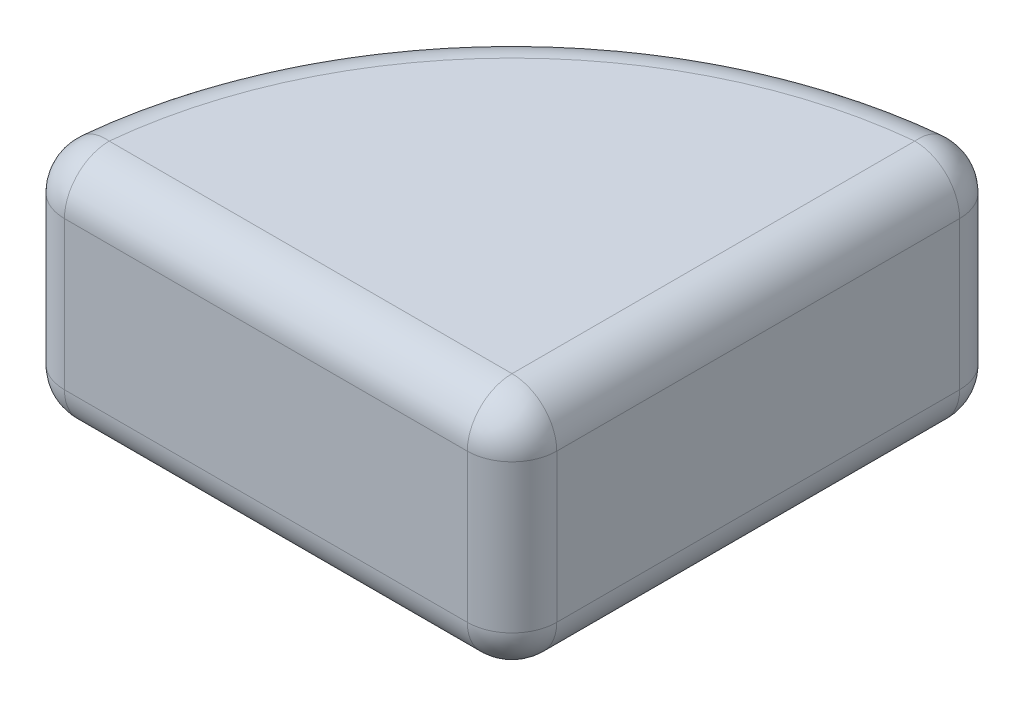
ISO-10303-21;
HEADER;
FILE_DESCRIPTION(('STEP AP214'),'2;1');
FILE_NAME('part.step','',(''),(''),'','','');
FILE_SCHEMA(('AUTOMOTIVE_DESIGN { 1 0 10303 214 1 1 1 1 }'));
ENDSEC;
DATA;
#1=APPLICATION_CONTEXT('core data for automotive mechanical design processes');
#2=APPLICATION_PROTOCOL_DEFINITION('international standard','automotive_design',2000,#1);
#3=PRODUCT_CONTEXT('',#1,'mechanical');
#4=PRODUCT('Part','Part','',(#3));
#5=PRODUCT_RELATED_PRODUCT_CATEGORY('part','',(#4));
#6=PRODUCT_DEFINITION_FORMATION('','',#4);
#7=PRODUCT_DEFINITION_CONTEXT('part definition',#1,'design');
#8=PRODUCT_DEFINITION('design','',#6,#7);
#9=PRODUCT_DEFINITION_SHAPE('','',#8);
#10=(LENGTH_UNIT() NAMED_UNIT(*) SI_UNIT(.MILLI.,.METRE.));
#11=(NAMED_UNIT(*) PLANE_ANGLE_UNIT() SI_UNIT($,.RADIAN.));
#12=(NAMED_UNIT(*) SI_UNIT($,.STERADIAN.) SOLID_ANGLE_UNIT());
#13=UNCERTAINTY_MEASURE_WITH_UNIT(LENGTH_MEASURE(1.E-05),#10,'distance_accuracy_value','');
#14=(GEOMETRIC_REPRESENTATION_CONTEXT(3) GLOBAL_UNCERTAINTY_ASSIGNED_CONTEXT((#13)) GLOBAL_UNIT_ASSIGNED_CONTEXT((#10,
#11,#12)) REPRESENTATION_CONTEXT('',''));
#15=CARTESIAN_POINT('',(0.,0.,0.));
#16=DIRECTION('',(0.,0.,1.));
#17=DIRECTION('',(1.,0.,0.));
#18=AXIS2_PLACEMENT_3D('',#15,#16,#17);
#19=CARTESIAN_POINT('',(0.,159.4,0.));
#20=DIRECTION('',(-1.,0.,0.));
#21=DIRECTION('',(0.,0.,1.));
#22=AXIS2_PLACEMENT_3D('',#19,#20,#21);
#23=PLANE('',#22);
#24=DIRECTION('',(0.,0.,-1.));
#25=VECTOR('',#24,1.);
#26=CARTESIAN_POINT('',(0.,30.,0.));
#27=LINE('',#26,#25);
#28=CARTESIAN_POINT('',(0.,30.,-30.));
#29=VERTEX_POINT('',#28);
#30=CARTESIAN_POINT('',(0.,30.,-300.104248553732));
#31=VERTEX_POINT('',#30);
#32=EDGE_CURVE('E169',#29,#31,#27,.T.);
#33=ORIENTED_EDGE('',*,*,#32,.T.);
#34=DIRECTION('',(0.,-1.,0.));
#35=VECTOR('',#34,1.);
#36=CARTESIAN_POINT('',(0.,159.4,-300.104248553732));
#37=LINE('',#36,#35);
#38=CARTESIAN_POINT('',(0.,129.4,-300.104248553732));
#39=VERTEX_POINT('',#38);
#40=EDGE_CURVE('E172',#31,#39,#37,.F.);
#41=ORIENTED_EDGE('',*,*,#40,.T.);
#42=DIRECTION('',(0.,0.,-1.));
#43=VECTOR('',#42,1.);
#44=CARTESIAN_POINT('',(0.,129.4,0.));
#45=LINE('',#44,#43);
#46=CARTESIAN_POINT('',(0.,129.4,-30.));
#47=VERTEX_POINT('',#46);
#48=EDGE_CURVE('E166',#39,#47,#45,.F.);
#49=ORIENTED_EDGE('',*,*,#48,.T.);
#50=DIRECTION('',(0.,-1.,0.));
#51=VECTOR('',#50,1.);
#52=CARTESIAN_POINT('',(0.,159.4,-30.));
#53=LINE('',#52,#51);
#54=EDGE_CURVE('E163',#47,#29,#53,.T.);
#55=ORIENTED_EDGE('',*,*,#54,.T.);
#56=EDGE_LOOP('',(#33,#41,#49,#55));
#57=FACE_BOUND('',#56,.T.);
#58=ADVANCED_FACE('F39',(#57),#23,.F.);
#59=CARTESIAN_POINT('',(0.,159.4,0.));
#60=DIRECTION('',(0.,-1.,0.));
#61=DIRECTION('',(0.,0.,-1.));
#62=AXIS2_PLACEMENT_3D('',#59,#60,#61);
#63=CYLINDRICAL_SURFACE('',#62,331.6);
#64=DIRECTION('',(0.,-1.,0.));
#65=VECTOR('',#64,1.);
#66=CARTESIAN_POINT('',(-32.9840848806366,159.4,-329.955466911198));
#67=LINE('',#66,#65);
#68=CARTESIAN_POINT('',(-32.9840848806366,129.4,-329.955466911198));
#69=VERTEX_POINT('',#68);
#70=CARTESIAN_POINT('',(-32.9840848806366,30.,-329.955466911198));
#71=VERTEX_POINT('',#70);
#72=EDGE_CURVE('E147',#69,#71,#67,.T.);
#73=ORIENTED_EDGE('',*,*,#72,.T.);
#74=CARTESIAN_POINT('',(0.,30.,0.));
#75=DIRECTION('',(0.,1.,0.));
#76=DIRECTION('',(0.,0.,1.));
#77=AXIS2_PLACEMENT_3D('',#74,#75,#76);
#78=CIRCLE('',#77,331.6);
#79=CARTESIAN_POINT('',(-329.955466911198,30.,-32.9840848806366));
#80=VERTEX_POINT('',#79);
#81=EDGE_CURVE('E116',#71,#80,#78,.T.);
#82=ORIENTED_EDGE('',*,*,#81,.T.);
#83=DIRECTION('',(0.,-1.,0.));
#84=VECTOR('',#83,1.);
#85=CARTESIAN_POINT('',(-329.955466911198,159.4,-32.9840848806366));
#86=LINE('',#85,#84);
#87=CARTESIAN_POINT('',(-329.955466911198,129.4,-32.9840848806366));
#88=VERTEX_POINT('',#87);
#89=EDGE_CURVE('E136',#80,#88,#86,.F.);
#90=ORIENTED_EDGE('',*,*,#89,.T.);
#91=CARTESIAN_POINT('',(0.,129.4,0.));
#92=DIRECTION('',(0.,1.,0.));
#93=DIRECTION('',(0.,0.,1.));
#94=AXIS2_PLACEMENT_3D('',#91,#92,#93);
#95=CIRCLE('',#94,331.6);
#96=EDGE_CURVE('E143',#88,#69,#95,.F.);
#97=ORIENTED_EDGE('',*,*,#96,.T.);
#98=EDGE_LOOP('',(#73,#82,#90,#97));
#99=FACE_BOUND('',#98,.T.);
#100=ADVANCED_FACE('F145',(#99),#63,.T.);
#101=CARTESIAN_POINT('',(-331.6,159.4,0.));
#102=DIRECTION('',(0.,0.,-1.));
#103=DIRECTION('',(-1.,0.,0.));
#104=AXIS2_PLACEMENT_3D('',#101,#102,#103);
#105=PLANE('',#104);
#106=DIRECTION('',(1.,0.,0.));
#107=VECTOR('',#106,1.);
#108=CARTESIAN_POINT('',(-331.6,129.4,0.));
#109=LINE('',#108,#107);
#110=CARTESIAN_POINT('',(-30.,129.4,0.));
#111=VERTEX_POINT('',#110);
#112=CARTESIAN_POINT('',(-300.104248553732,129.4,0.));
#113=VERTEX_POINT('',#112);
#114=EDGE_CURVE('E49',#111,#113,#109,.F.);
#115=ORIENTED_EDGE('',*,*,#114,.T.);
#116=DIRECTION('',(0.,-1.,0.));
#117=VECTOR('',#116,1.);
#118=CARTESIAN_POINT('',(-300.104248553732,159.4,0.));
#119=LINE('',#118,#117);
#120=CARTESIAN_POINT('',(-300.104248553732,30.,0.));
#121=VERTEX_POINT('',#120);
#122=EDGE_CURVE('E11',#113,#121,#119,.T.);
#123=ORIENTED_EDGE('',*,*,#122,.T.);
#124=DIRECTION('',(1.,0.,0.));
#125=VECTOR('',#124,1.);
#126=CARTESIAN_POINT('',(-331.6,30.,0.));
#127=LINE('',#126,#125);
#128=CARTESIAN_POINT('',(-30.,30.,0.));
#129=VERTEX_POINT('',#128);
#130=EDGE_CURVE('E186',#121,#129,#127,.T.);
#131=ORIENTED_EDGE('',*,*,#130,.T.);
#132=DIRECTION('',(0.,-1.,0.));
#133=VECTOR('',#132,1.);
#134=CARTESIAN_POINT('',(-30.,159.4,0.));
#135=LINE('',#134,#133);
#136=EDGE_CURVE('E60',#129,#111,#135,.F.);
#137=ORIENTED_EDGE('',*,*,#136,.T.);
#138=EDGE_LOOP('',(#115,#123,#131,#137));
#139=FACE_BOUND('',#138,.T.);
#140=ADVANCED_FACE('F287',(#139),#105,.F.);
#141=CARTESIAN_POINT('',(0.,159.4,0.));
#142=DIRECTION('',(0.,1.,0.));
#143=DIRECTION('',(0.,0.,1.));
#144=AXIS2_PLACEMENT_3D('',#141,#142,#143);
#145=PLANE('',#144);
#146=DIRECTION('',(0.,0.,-1.));
#147=VECTOR('',#146,1.);
#148=CARTESIAN_POINT('',(-30.,159.4,-331.6));
#149=LINE('',#148,#147);
#150=CARTESIAN_POINT('',(-30.,159.4,-30.));
#151=VERTEX_POINT('',#150);
#152=CARTESIAN_POINT('',(-30.,159.4,-300.104248553732));
#153=VERTEX_POINT('',#152);
#154=EDGE_CURVE('E179',#151,#153,#149,.T.);
#155=ORIENTED_EDGE('',*,*,#154,.T.);
#156=CARTESIAN_POINT('',(0.,159.4,0.));
#157=DIRECTION('',(0.,1.,0.));
#158=DIRECTION('',(0.,0.,1.));
#159=AXIS2_PLACEMENT_3D('',#156,#157,#158);
#160=CIRCLE('',#159,301.6);
#161=CARTESIAN_POINT('',(-300.104248553732,159.4,-30.));
#162=VERTEX_POINT('',#161);
#163=EDGE_CURVE('E182',#153,#162,#160,.T.);
#164=ORIENTED_EDGE('',*,*,#163,.T.);
#165=DIRECTION('',(1.,0.,0.));
#166=VECTOR('',#165,1.);
#167=CARTESIAN_POINT('',(0.,159.4,-30.));
#168=LINE('',#167,#166);
#169=EDGE_CURVE('E176',#162,#151,#168,.T.);
#170=ORIENTED_EDGE('',*,*,#169,.T.);
#171=EDGE_LOOP('',(#155,#164,#170));
#172=FACE_BOUND('',#171,.T.);
#173=ADVANCED_FACE('F413',(#172),#145,.T.);
#174=CARTESIAN_POINT('',(0.,0.,0.));
#175=DIRECTION('',(0.,1.,0.));
#176=DIRECTION('',(0.,0.,1.));
#177=AXIS2_PLACEMENT_3D('',#174,#175,#176);
#178=PLANE('',#177);
#179=DIRECTION('',(1.,0.,0.));
#180=VECTOR('',#179,1.);
#181=CARTESIAN_POINT('',(0.,0.,-30.));
#182=LINE('',#181,#180);
#183=CARTESIAN_POINT('',(-30.,0.,-30.));
#184=VERTEX_POINT('',#183);
#185=CARTESIAN_POINT('',(-300.104248553732,0.,-30.));
#186=VERTEX_POINT('',#185);
#187=EDGE_CURVE('E150',#184,#186,#182,.F.);
#188=ORIENTED_EDGE('',*,*,#187,.T.);
#189=CARTESIAN_POINT('',(0.,0.,0.));
#190=DIRECTION('',(0.,1.,0.));
#191=DIRECTION('',(0.,0.,1.));
#192=AXIS2_PLACEMENT_3D('',#189,#190,#191);
#193=CIRCLE('',#192,301.6);
#194=CARTESIAN_POINT('',(-30.,0.,-300.104248553732));
#195=VERTEX_POINT('',#194);
#196=EDGE_CURVE('E118',#186,#195,#193,.F.);
#197=ORIENTED_EDGE('',*,*,#196,.T.);
#198=DIRECTION('',(0.,0.,-1.));
#199=VECTOR('',#198,1.);
#200=CARTESIAN_POINT('',(-30.,0.,0.));
#201=LINE('',#200,#199);
#202=EDGE_CURVE('E154',#195,#184,#201,.F.);
#203=ORIENTED_EDGE('',*,*,#202,.T.);
#204=EDGE_LOOP('',(#188,#197,#203));
#205=FACE_BOUND('',#204,.T.);
#206=ADVANCED_FACE('F405',(#205),#178,.F.);
#207=CARTESIAN_POINT('',(-30.,129.4,-30.));
#208=DIRECTION('',(0.,0.,1.));
#209=DIRECTION('',(1.,0.,0.));
#210=AXIS2_PLACEMENT_3D('',#207,#208,#209);
#211=SPHERICAL_SURFACE('',#210,30.);
#212=CARTESIAN_POINT('',(-30.,129.4,-30.));
#213=DIRECTION('',(0.,1.,0.));
#214=DIRECTION('',(0.,0.,1.));
#215=AXIS2_PLACEMENT_3D('',#212,#213,#214);
#216=CIRCLE('',#215,30.);
#217=EDGE_CURVE('E236',#47,#111,#216,.F.);
#218=ORIENTED_EDGE('',*,*,#217,.F.);
#219=CARTESIAN_POINT('',(-30.,129.4,-30.));
#220=DIRECTION('',(0.,0.,1.));
#221=DIRECTION('',(1.,0.,0.));
#222=AXIS2_PLACEMENT_3D('',#219,#220,#221);
#223=CIRCLE('',#222,30.);
#224=EDGE_CURVE('E43',#151,#47,#223,.F.);
#225=ORIENTED_EDGE('',*,*,#224,.F.);
#226=CARTESIAN_POINT('',(-30.,129.4,-30.));
#227=DIRECTION('',(1.,0.,0.));
#228=DIRECTION('',(0.,0.,-1.));
#229=AXIS2_PLACEMENT_3D('',#226,#227,#228);
#230=CIRCLE('',#229,30.);
#231=EDGE_CURVE('E238',#111,#151,#230,.F.);
#232=ORIENTED_EDGE('',*,*,#231,.F.);
#233=EDGE_LOOP('',(#218,#225,#232));
#234=FACE_BOUND('',#233,.T.);
#235=ADVANCED_FACE('F41',(#234),#211,.T.);
#236=CARTESIAN_POINT('',(-30.,129.4,0.));
#237=DIRECTION('',(0.,0.,1.));
#238=DIRECTION('',(1.,0.,0.));
#239=AXIS2_PLACEMENT_3D('',#236,#237,#238);
#240=CYLINDRICAL_SURFACE('',#239,30.);
#241=ORIENTED_EDGE('',*,*,#224,.T.);
#242=ORIENTED_EDGE('',*,*,#48,.F.);
#243=CARTESIAN_POINT('',(-30.,129.4,-300.104248553732));
#244=DIRECTION('',(0.,0.,-1.));
#245=DIRECTION('',(-1.,0.,0.));
#246=AXIS2_PLACEMENT_3D('',#243,#244,#245);
#247=CIRCLE('',#246,30.);
#248=EDGE_CURVE('E232',#153,#39,#247,.T.);
#249=ORIENTED_EDGE('',*,*,#248,.F.);
#250=ORIENTED_EDGE('',*,*,#154,.F.);
#251=EDGE_LOOP('',(#241,#242,#249,#250));
#252=FACE_BOUND('',#251,.T.);
#253=ADVANCED_FACE('F251',(#252),#240,.T.);
#254=CARTESIAN_POINT('',(0.,129.4,0.));
#255=DIRECTION('',(0.,1.,0.));
#256=DIRECTION('',(0.,0.,1.));
#257=AXIS2_PLACEMENT_3D('',#254,#255,#256);
#258=TOROIDAL_SURFACE('',#257,301.6,30.);
#259=CARTESIAN_POINT('',(-300.104248553732,129.4,-30.));
#260=DIRECTION('',(-0.0994694960212201,0.,0.995040611915556));
#261=DIRECTION('',(0.995040611915556,0.,0.0994694960212202));
#262=AXIS2_PLACEMENT_3D('',#259,#260,#261);
#263=CIRCLE('',#262,30.);
#264=EDGE_CURVE('E224',#162,#88,#263,.T.);
#265=ORIENTED_EDGE('',*,*,#264,.F.);
#266=ORIENTED_EDGE('',*,*,#163,.F.);
#267=CARTESIAN_POINT('',(-30.,129.4,-300.104248553732));
#268=DIRECTION('',(0.995040611915556,0.,-0.0994694960212201));
#269=DIRECTION('',(-0.0994694960212202,0.,-0.995040611915556));
#270=AXIS2_PLACEMENT_3D('',#267,#268,#269);
#271=CIRCLE('',#270,30.);
#272=EDGE_CURVE('E228',#69,#153,#271,.T.);
#273=ORIENTED_EDGE('',*,*,#272,.F.);
#274=ORIENTED_EDGE('',*,*,#96,.F.);
#275=EDGE_LOOP('',(#265,#266,#273,#274));
#276=FACE_BOUND('',#275,.T.);
#277=ADVANCED_FACE('F380',(#276),#258,.T.);
#278=CARTESIAN_POINT('',(0.,129.4,-30.));
#279=DIRECTION('',(-1.,0.,0.));
#280=DIRECTION('',(0.,0.,1.));
#281=AXIS2_PLACEMENT_3D('',#278,#279,#280);
#282=CYLINDRICAL_SURFACE('',#281,30.);
#283=ORIENTED_EDGE('',*,*,#231,.T.);
#284=ORIENTED_EDGE('',*,*,#169,.F.);
#285=CARTESIAN_POINT('',(-300.104248553732,129.4,-30.));
#286=DIRECTION('',(-1.,0.,0.));
#287=DIRECTION('',(0.,0.,1.));
#288=AXIS2_PLACEMENT_3D('',#285,#286,#287);
#289=CIRCLE('',#288,30.);
#290=EDGE_CURVE('E221',#113,#162,#289,.T.);
#291=ORIENTED_EDGE('',*,*,#290,.F.);
#292=ORIENTED_EDGE('',*,*,#114,.F.);
#293=EDGE_LOOP('',(#283,#284,#291,#292));
#294=FACE_BOUND('',#293,.T.);
#295=ADVANCED_FACE('F371',(#294),#282,.T.);
#296=CARTESIAN_POINT('',(-30.,159.4,-30.));
#297=DIRECTION('',(0.,-1.,0.));
#298=DIRECTION('',(0.,0.,-1.));
#299=AXIS2_PLACEMENT_3D('',#296,#297,#298);
#300=CYLINDRICAL_SURFACE('',#299,30.);
#301=ORIENTED_EDGE('',*,*,#217,.T.);
#302=ORIENTED_EDGE('',*,*,#136,.F.);
#303=CARTESIAN_POINT('',(-30.,30.,-30.));
#304=DIRECTION('',(0.,-1.,0.));
#305=DIRECTION('',(0.,0.,-1.));
#306=AXIS2_PLACEMENT_3D('',#303,#304,#305);
#307=CIRCLE('',#306,30.);
#308=EDGE_CURVE('E217',#29,#129,#307,.T.);
#309=ORIENTED_EDGE('',*,*,#308,.F.);
#310=ORIENTED_EDGE('',*,*,#54,.F.);
#311=EDGE_LOOP('',(#301,#302,#309,#310));
#312=FACE_BOUND('',#311,.T.);
#313=ADVANCED_FACE('F257',(#312),#300,.T.);
#314=CARTESIAN_POINT('',(-30.,129.4,-300.104248553732));
#315=DIRECTION('',(0.,0.,1.));
#316=DIRECTION('',(1.,0.,0.));
#317=AXIS2_PLACEMENT_3D('',#314,#315,#316);
#318=SPHERICAL_SURFACE('',#317,30.);
#319=ORIENTED_EDGE('',*,*,#272,.T.);
#320=ORIENTED_EDGE('',*,*,#248,.T.);
#321=CARTESIAN_POINT('',(-30.,129.4,-300.104248553732));
#322=DIRECTION('',(0.,1.,0.));
#323=DIRECTION('',(0.,0.,1.));
#324=AXIS2_PLACEMENT_3D('',#321,#322,#323);
#325=CIRCLE('',#324,30.);
#326=EDGE_CURVE('E210',#69,#39,#325,.F.);
#327=ORIENTED_EDGE('',*,*,#326,.F.);
#328=EDGE_LOOP('',(#319,#320,#327));
#329=FACE_BOUND('',#328,.T.);
#330=ADVANCED_FACE('F352',(#329),#318,.T.);
#331=CARTESIAN_POINT('',(-300.104248553732,129.4,-30.));
#332=DIRECTION('',(0.,0.,1.));
#333=DIRECTION('',(1.,0.,0.));
#334=AXIS2_PLACEMENT_3D('',#331,#332,#333);
#335=SPHERICAL_SURFACE('',#334,30.);
#336=ORIENTED_EDGE('',*,*,#290,.T.);
#337=ORIENTED_EDGE('',*,*,#264,.T.);
#338=CARTESIAN_POINT('',(-300.104248553732,129.4,-30.));
#339=DIRECTION('',(0.,1.,0.));
#340=DIRECTION('',(0.,0.,1.));
#341=AXIS2_PLACEMENT_3D('',#338,#339,#340);
#342=CIRCLE('',#341,30.);
#343=EDGE_CURVE('E139',#113,#88,#342,.F.);
#344=ORIENTED_EDGE('',*,*,#343,.F.);
#345=EDGE_LOOP('',(#336,#337,#344));
#346=FACE_BOUND('',#345,.T.);
#347=ADVANCED_FACE('F342',(#346),#335,.T.);
#348=CARTESIAN_POINT('',(-30.,30.,-30.));
#349=DIRECTION('',(0.,0.,1.));
#350=DIRECTION('',(1.,0.,0.));
#351=AXIS2_PLACEMENT_3D('',#348,#349,#350);
#352=SPHERICAL_SURFACE('',#351,30.);
#353=CARTESIAN_POINT('',(-30.,30.,-30.));
#354=DIRECTION('',(1.,0.,0.));
#355=DIRECTION('',(0.,0.,-1.));
#356=AXIS2_PLACEMENT_3D('',#353,#354,#355);
#357=CIRCLE('',#356,30.);
#358=EDGE_CURVE('E204',#184,#129,#357,.F.);
#359=ORIENTED_EDGE('',*,*,#358,.F.);
#360=CARTESIAN_POINT('',(-30.,30.,-30.));
#361=DIRECTION('',(0.,0.,1.));
#362=DIRECTION('',(1.,0.,0.));
#363=AXIS2_PLACEMENT_3D('',#360,#361,#362);
#364=CIRCLE('',#363,30.);
#365=EDGE_CURVE('E213',#29,#184,#364,.F.);
#366=ORIENTED_EDGE('',*,*,#365,.F.);
#367=ORIENTED_EDGE('',*,*,#308,.T.);
#368=EDGE_LOOP('',(#359,#366,#367));
#369=FACE_BOUND('',#368,.T.);
#370=ADVANCED_FACE('F333',(#369),#352,.T.);
#371=CARTESIAN_POINT('',(-30.,30.,0.));
#372=DIRECTION('',(0.,0.,-1.));
#373=DIRECTION('',(-1.,0.,0.));
#374=AXIS2_PLACEMENT_3D('',#371,#372,#373);
#375=CYLINDRICAL_SURFACE('',#374,30.);
#376=ORIENTED_EDGE('',*,*,#365,.T.);
#377=ORIENTED_EDGE('',*,*,#202,.F.);
#378=CARTESIAN_POINT('',(-30.,30.,-300.104248553732));
#379=DIRECTION('',(0.,0.,-1.));
#380=DIRECTION('',(-1.,0.,0.));
#381=AXIS2_PLACEMENT_3D('',#378,#379,#380);
#382=CIRCLE('',#381,30.);
#383=EDGE_CURVE('E200',#31,#195,#382,.T.);
#384=ORIENTED_EDGE('',*,*,#383,.F.);
#385=ORIENTED_EDGE('',*,*,#32,.F.);
#386=EDGE_LOOP('',(#376,#377,#384,#385));
#387=FACE_BOUND('',#386,.T.);
#388=ADVANCED_FACE('F269',(#387),#375,.T.);
#389=CARTESIAN_POINT('',(-30.,159.4,-300.104248553732));
#390=DIRECTION('',(0.,-1.,0.));
#391=DIRECTION('',(0.,0.,-1.));
#392=AXIS2_PLACEMENT_3D('',#389,#390,#391);
#393=CYLINDRICAL_SURFACE('',#392,30.);
#394=ORIENTED_EDGE('',*,*,#326,.T.);
#395=ORIENTED_EDGE('',*,*,#40,.F.);
#396=CARTESIAN_POINT('',(-30.,30.,-300.104248553732));
#397=DIRECTION('',(0.,-1.,0.));
#398=DIRECTION('',(0.,0.,-1.));
#399=AXIS2_PLACEMENT_3D('',#396,#397,#398);
#400=CIRCLE('',#399,30.);
#401=EDGE_CURVE('E133',#71,#31,#400,.T.);
#402=ORIENTED_EDGE('',*,*,#401,.F.);
#403=ORIENTED_EDGE('',*,*,#72,.F.);
#404=EDGE_LOOP('',(#394,#395,#402,#403));
#405=FACE_BOUND('',#404,.T.);
#406=ADVANCED_FACE('F264',(#405),#393,.T.);
#407=CARTESIAN_POINT('',(-300.104248553732,159.4,-30.));
#408=DIRECTION('',(0.,-1.,0.));
#409=DIRECTION('',(0.,0.,-1.));
#410=AXIS2_PLACEMENT_3D('',#407,#408,#409);
#411=CYLINDRICAL_SURFACE('',#410,30.);
#412=ORIENTED_EDGE('',*,*,#343,.T.);
#413=ORIENTED_EDGE('',*,*,#89,.F.);
#414=CARTESIAN_POINT('',(-300.104248553732,30.,-30.));
#415=DIRECTION('',(0.,-1.,0.));
#416=DIRECTION('',(0.,0.,-1.));
#417=AXIS2_PLACEMENT_3D('',#414,#415,#416);
#418=CIRCLE('',#417,30.);
#419=EDGE_CURVE('E124',#121,#80,#418,.T.);
#420=ORIENTED_EDGE('',*,*,#419,.F.);
#421=ORIENTED_EDGE('',*,*,#122,.F.);
#422=EDGE_LOOP('',(#412,#413,#420,#421));
#423=FACE_BOUND('',#422,.T.);
#424=ADVANCED_FACE('F137',(#423),#411,.T.);
#425=CARTESIAN_POINT('',(-331.6,30.,-30.));
#426=DIRECTION('',(1.,0.,0.));
#427=DIRECTION('',(0.,0.,-1.));
#428=AXIS2_PLACEMENT_3D('',#425,#426,#427);
#429=CYLINDRICAL_SURFACE('',#428,30.);
#430=ORIENTED_EDGE('',*,*,#358,.T.);
#431=ORIENTED_EDGE('',*,*,#130,.F.);
#432=CARTESIAN_POINT('',(-300.104248553732,30.,-30.));
#433=DIRECTION('',(-1.,0.,0.));
#434=DIRECTION('',(0.,0.,1.));
#435=AXIS2_PLACEMENT_3D('',#432,#433,#434);
#436=CIRCLE('',#435,30.);
#437=EDGE_CURVE('E128',#186,#121,#436,.T.);
#438=ORIENTED_EDGE('',*,*,#437,.F.);
#439=ORIENTED_EDGE('',*,*,#187,.F.);
#440=EDGE_LOOP('',(#430,#431,#438,#439));
#441=FACE_BOUND('',#440,.T.);
#442=ADVANCED_FACE('F273',(#441),#429,.T.);
#443=CARTESIAN_POINT('',(-30.,30.,-300.104248553732));
#444=DIRECTION('',(0.,0.,1.));
#445=DIRECTION('',(1.,0.,0.));
#446=AXIS2_PLACEMENT_3D('',#443,#444,#445);
#447=SPHERICAL_SURFACE('',#446,30.);
#448=ORIENTED_EDGE('',*,*,#401,.T.);
#449=ORIENTED_EDGE('',*,*,#383,.T.);
#450=CARTESIAN_POINT('',(-30.,30.,-300.104248553732));
#451=DIRECTION('',(0.995040611915556,0.,-0.0994694960212201));
#452=DIRECTION('',(-0.0994694960212202,0.,-0.995040611915556));
#453=AXIS2_PLACEMENT_3D('',#450,#451,#452);
#454=CIRCLE('',#453,30.);
#455=EDGE_CURVE('E121',#71,#195,#454,.F.);
#456=ORIENTED_EDGE('',*,*,#455,.F.);
#457=EDGE_LOOP('',(#448,#449,#456));
#458=FACE_BOUND('',#457,.T.);
#459=ADVANCED_FACE('F271',(#458),#447,.T.);
#460=CARTESIAN_POINT('',(-300.104248553732,30.,-30.));
#461=DIRECTION('',(0.,0.,1.));
#462=DIRECTION('',(1.,0.,0.));
#463=AXIS2_PLACEMENT_3D('',#460,#461,#462);
#464=SPHERICAL_SURFACE('',#463,30.);
#465=ORIENTED_EDGE('',*,*,#437,.T.);
#466=ORIENTED_EDGE('',*,*,#419,.T.);
#467=CARTESIAN_POINT('',(-300.104248553732,30.,-30.));
#468=DIRECTION('',(-0.0994694960212201,0.,0.995040611915556));
#469=DIRECTION('',(0.995040611915556,0.,0.0994694960212202));
#470=AXIS2_PLACEMENT_3D('',#467,#468,#469);
#471=CIRCLE('',#470,30.);
#472=EDGE_CURVE('E112',#186,#80,#471,.F.);
#473=ORIENTED_EDGE('',*,*,#472,.F.);
#474=EDGE_LOOP('',(#465,#466,#473));
#475=FACE_BOUND('',#474,.T.);
#476=ADVANCED_FACE('F126',(#475),#464,.T.);
#477=CARTESIAN_POINT('',(0.,30.,0.));
#478=DIRECTION('',(0.,1.,0.));
#479=DIRECTION('',(0.,0.,1.));
#480=AXIS2_PLACEMENT_3D('',#477,#478,#479);
#481=TOROIDAL_SURFACE('',#480,301.6,30.);
#482=ORIENTED_EDGE('',*,*,#455,.T.);
#483=ORIENTED_EDGE('',*,*,#196,.F.);
#484=ORIENTED_EDGE('',*,*,#472,.T.);
#485=ORIENTED_EDGE('',*,*,#81,.F.);
#486=EDGE_LOOP('',(#482,#483,#484,#485));
#487=FACE_BOUND('',#486,.T.);
#488=ADVANCED_FACE('F114',(#487),#481,.T.);
#489=CLOSED_SHELL('',(#58,#100,#140,#173,#206,#235,#253,#277,#295,#313,#330,#347,#370,#388,#406,
#424,#442,#459,#476,#488));
#490=MANIFOLD_SOLID_BREP('B2',#489);
#491=ADVANCED_BREP_SHAPE_REPRESENTATION('',(#18,#490),#14);
#492=SHAPE_DEFINITION_REPRESENTATION(#9,#491);
ENDSEC;
END-ISO-10303-21;
